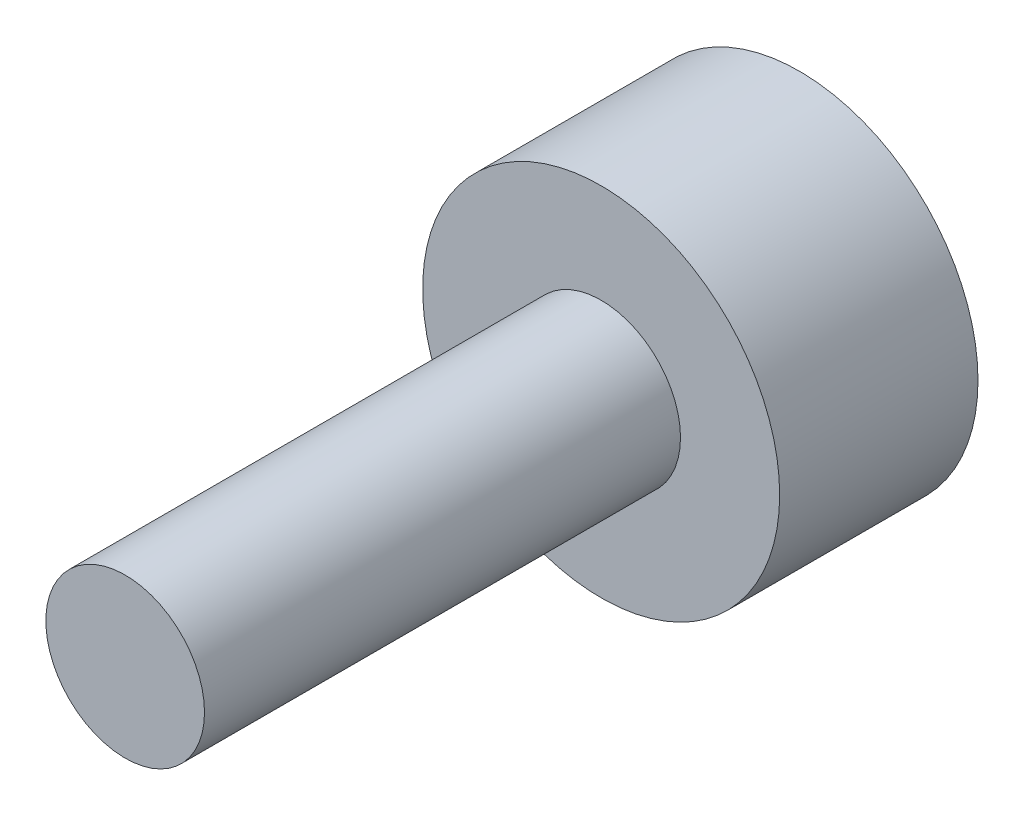
ISO-10303-21;
HEADER;
FILE_DESCRIPTION(('STEP AP214'),'2;1');
FILE_NAME('part.step','',(''),(''),'','','');
FILE_SCHEMA(('AUTOMOTIVE_DESIGN { 1 0 10303 214 1 1 1 1 }'));
ENDSEC;
DATA;
#1=APPLICATION_CONTEXT('core data for automotive mechanical design processes');
#2=APPLICATION_PROTOCOL_DEFINITION('international standard','automotive_design',2000,#1);
#3=PRODUCT_CONTEXT('',#1,'mechanical');
#4=PRODUCT('Part','Part','',(#3));
#5=PRODUCT_RELATED_PRODUCT_CATEGORY('part','',(#4));
#6=PRODUCT_DEFINITION_FORMATION('','',#4);
#7=PRODUCT_DEFINITION_CONTEXT('part definition',#1,'design');
#8=PRODUCT_DEFINITION('design','',#6,#7);
#9=PRODUCT_DEFINITION_SHAPE('','',#8);
#10=(LENGTH_UNIT() NAMED_UNIT(*) SI_UNIT(.MILLI.,.METRE.));
#11=(NAMED_UNIT(*) PLANE_ANGLE_UNIT() SI_UNIT($,.RADIAN.));
#12=(NAMED_UNIT(*) SI_UNIT($,.STERADIAN.) SOLID_ANGLE_UNIT());
#13=UNCERTAINTY_MEASURE_WITH_UNIT(LENGTH_MEASURE(1.E-05),#10,'distance_accuracy_value','');
#14=(GEOMETRIC_REPRESENTATION_CONTEXT(3) GLOBAL_UNCERTAINTY_ASSIGNED_CONTEXT((#13)) GLOBAL_UNIT_ASSIGNED_CONTEXT((#10,
#11,#12)) REPRESENTATION_CONTEXT('',''));
#15=CARTESIAN_POINT('',(0.,0.,0.));
#16=DIRECTION('',(0.,0.,1.));
#17=DIRECTION('',(1.,0.,0.));
#18=AXIS2_PLACEMENT_3D('',#15,#16,#17);
#19=CARTESIAN_POINT('',(0.,0.,2.5));
#20=DIRECTION('',(0.,0.,1.));
#21=DIRECTION('',(1.,0.,0.));
#22=AXIS2_PLACEMENT_3D('',#19,#20,#21);
#23=PLANE('',#22);
#24=CARTESIAN_POINT('',(0.,0.,2.5));
#25=DIRECTION('',(0.,0.,1.));
#26=DIRECTION('',(1.,0.,0.));
#27=AXIS2_PLACEMENT_3D('',#24,#25,#26);
#28=CIRCLE('',#27,2.25);
#29=CARTESIAN_POINT('',(2.25,0.,2.5));
#30=VERTEX_POINT('',#29);
#31=EDGE_CURVE('E11',#30,#30,#28,.T.);
#32=ORIENTED_EDGE('',*,*,#31,.T.);
#33=EDGE_LOOP('',(#32));
#34=FACE_BOUND('',#33,.T.);
#35=CARTESIAN_POINT('',(0.,0.,2.5));
#36=DIRECTION('',(0.,0.,1.));
#37=DIRECTION('',(1.,0.,0.));
#38=AXIS2_PLACEMENT_3D('',#35,#36,#37);
#39=CIRCLE('',#38,1.);
#40=CARTESIAN_POINT('',(1.,0.,2.5));
#41=VERTEX_POINT('',#40);
#42=EDGE_CURVE('E139',#41,#41,#39,.T.);
#43=ORIENTED_EDGE('',*,*,#42,.F.);
#44=EDGE_LOOP('',(#43));
#45=FACE_BOUND('',#44,.T.);
#46=ADVANCED_FACE('F37',(#34,#45),#23,.T.);
#47=CARTESIAN_POINT('',(0.,0.,2.5));
#48=DIRECTION('',(0.,0.,-1.));
#49=DIRECTION('',(-1.,0.,0.));
#50=AXIS2_PLACEMENT_3D('',#47,#48,#49);
#51=CYLINDRICAL_SURFACE('',#50,2.25);
#52=ORIENTED_EDGE('',*,*,#31,.F.);
#53=EDGE_LOOP('',(#52));
#54=FACE_BOUND('',#53,.T.);
#55=CARTESIAN_POINT('',(0.,0.,0.));
#56=DIRECTION('',(0.,0.,1.));
#57=DIRECTION('',(1.,0.,0.));
#58=AXIS2_PLACEMENT_3D('',#55,#56,#57);
#59=CIRCLE('',#58,2.25);
#60=CARTESIAN_POINT('',(2.25,0.,0.));
#61=VERTEX_POINT('',#60);
#62=EDGE_CURVE('E41',#61,#61,#59,.T.);
#63=ORIENTED_EDGE('',*,*,#62,.T.);
#64=EDGE_LOOP('',(#63));
#65=FACE_BOUND('',#64,.T.);
#66=ADVANCED_FACE('F39',(#54,#65),#51,.T.);
#67=CARTESIAN_POINT('',(0.,0.,0.));
#68=DIRECTION('',(0.,0.,1.));
#69=DIRECTION('',(1.,0.,0.));
#70=AXIS2_PLACEMENT_3D('',#67,#68,#69);
#71=PLANE('',#70);
#72=DIRECTION('',(-0.205557637970208,0.978645010957553,0.));
#73=VECTOR('',#72,1.);
#74=CARTESIAN_POINT('',(-0.852242502162426,-0.763657678817253,0.));
#75=LINE('',#74,#73);
#76=CARTESIAN_POINT('',(-0.852242502162426,-0.763657678817253,0.));
#77=VERTEX_POINT('',#76);
#78=CARTESIAN_POINT('',(-1.08746820073201,0.356234817648851,0.));
#79=VERTEX_POINT('',#78);
#80=EDGE_CURVE('E126',#77,#79,#75,.T.);
#81=ORIENTED_EDGE('',*,*,#80,.F.);
#82=DIRECTION('',(-0.950310259761245,0.311304369054652,0.));
#83=VECTOR('',#82,1.);
#84=CARTESIAN_POINT('',(0.235225698569587,-1.1198924964661,0.));
#85=LINE('',#84,#83);
#86=CARTESIAN_POINT('',(0.235225698569587,-1.1198924964661,0.));
#87=VERTEX_POINT('',#86);
#88=EDGE_CURVE('E52',#87,#77,#85,.T.);
#89=ORIENTED_EDGE('',*,*,#88,.F.);
#90=DIRECTION('',(-0.744752621791037,-0.667340641902901,0.));
#91=VECTOR('',#90,1.);
#92=CARTESIAN_POINT('',(1.08746820073201,-0.356234817648848,0.));
#93=LINE('',#92,#91);
#94=CARTESIAN_POINT('',(1.08746820073201,-0.356234817648848,0.));
#95=VERTEX_POINT('',#94);
#96=EDGE_CURVE('E135',#95,#87,#93,.T.);
#97=ORIENTED_EDGE('',*,*,#96,.F.);
#98=DIRECTION('',(0.205557637970207,-0.978645010957553,0.));
#99=VECTOR('',#98,1.);
#100=CARTESIAN_POINT('',(0.852242502162427,0.763657678817255,0.));
#101=LINE('',#100,#99);
#102=CARTESIAN_POINT('',(0.852242502162427,0.763657678817255,0.));
#103=VERTEX_POINT('',#102);
#104=EDGE_CURVE('E133',#103,#95,#101,.T.);
#105=ORIENTED_EDGE('',*,*,#104,.F.);
#106=DIRECTION('',(0.950310259761245,-0.311304369054652,0.));
#107=VECTOR('',#106,1.);
#108=CARTESIAN_POINT('',(-0.235225698569587,1.1198924964661,0.));
#109=LINE('',#108,#107);
#110=CARTESIAN_POINT('',(-0.235225698569587,1.1198924964661,0.));
#111=VERTEX_POINT('',#110);
#112=EDGE_CURVE('E100',#111,#103,#109,.T.);
#113=ORIENTED_EDGE('',*,*,#112,.F.);
#114=DIRECTION('',(0.744752621791037,0.667340641902901,0.));
#115=VECTOR('',#114,1.);
#116=CARTESIAN_POINT('',(-1.08746820073201,0.356234817648851,0.));
#117=LINE('',#116,#115);
#118=EDGE_CURVE('E129',#79,#111,#117,.T.);
#119=ORIENTED_EDGE('',*,*,#118,.F.);
#120=EDGE_LOOP('',(#81,#89,#97,#105,#113,#119));
#121=FACE_BOUND('',#120,.T.);
#122=ORIENTED_EDGE('',*,*,#62,.F.);
#123=EDGE_LOOP('',(#122));
#124=FACE_BOUND('',#123,.T.);
#125=ADVANCED_FACE('F159',(#121,#124),#71,.F.);
#126=CARTESIAN_POINT('',(0.,0.,8.5));
#127=DIRECTION('',(0.,0.,-1.));
#128=DIRECTION('',(-1.,0.,0.));
#129=AXIS2_PLACEMENT_3D('',#126,#127,#128);
#130=CYLINDRICAL_SURFACE('',#129,1.);
#131=CARTESIAN_POINT('',(0.,0.,8.5));
#132=DIRECTION('',(0.,0.,1.));
#133=DIRECTION('',(1.,0.,0.));
#134=AXIS2_PLACEMENT_3D('',#131,#132,#133);
#135=CIRCLE('',#134,1.);
#136=CARTESIAN_POINT('',(1.,0.,8.5));
#137=VERTEX_POINT('',#136);
#138=EDGE_CURVE('E145',#137,#137,#135,.T.);
#139=ORIENTED_EDGE('',*,*,#138,.F.);
#140=EDGE_LOOP('',(#139));
#141=FACE_BOUND('',#140,.T.);
#142=ORIENTED_EDGE('',*,*,#42,.T.);
#143=EDGE_LOOP('',(#142));
#144=FACE_BOUND('',#143,.T.);
#145=ADVANCED_FACE('F151',(#141,#144),#130,.T.);
#146=CARTESIAN_POINT('',(0.,0.,8.5));
#147=DIRECTION('',(0.,0.,1.));
#148=DIRECTION('',(1.,0.,0.));
#149=AXIS2_PLACEMENT_3D('',#146,#147,#148);
#150=PLANE('',#149);
#151=ORIENTED_EDGE('',*,*,#138,.T.);
#152=EDGE_LOOP('',(#151));
#153=FACE_BOUND('',#152,.T.);
#154=ADVANCED_FACE('F168',(#153),#150,.T.);
#155=CARTESIAN_POINT('',(0.235225698569587,-1.1198924964661,2.));
#156=DIRECTION('',(-0.311304369054652,-0.950310259761245,0.));
#157=DIRECTION('',(0.950310259761245,-0.311304369054652,0.));
#158=AXIS2_PLACEMENT_3D('',#155,#156,#157);
#159=PLANE('',#158);
#160=ORIENTED_EDGE('',*,*,#88,.T.);
#161=DIRECTION('',(0.,0.,-1.));
#162=VECTOR('',#161,1.);
#163=CARTESIAN_POINT('',(-0.852242502162426,-0.763657678817253,2.));
#164=LINE('',#163,#162);
#165=CARTESIAN_POINT('',(-0.852242502162426,-0.763657678817253,2.));
#166=VERTEX_POINT('',#165);
#167=EDGE_CURVE('E82',#166,#77,#164,.T.);
#168=ORIENTED_EDGE('',*,*,#167,.F.);
#169=DIRECTION('',(-0.950310259761245,0.311304369054652,0.));
#170=VECTOR('',#169,1.);
#171=CARTESIAN_POINT('',(0.235225698569587,-1.1198924964661,2.));
#172=LINE('',#171,#170);
#173=CARTESIAN_POINT('',(0.235225698569587,-1.1198924964661,2.));
#174=VERTEX_POINT('',#173);
#175=EDGE_CURVE('E137',#174,#166,#172,.T.);
#176=ORIENTED_EDGE('',*,*,#175,.F.);
#177=DIRECTION('',(0.,0.,-1.));
#178=VECTOR('',#177,1.);
#179=CARTESIAN_POINT('',(0.235225698569587,-1.1198924964661,2.));
#180=LINE('',#179,#178);
#181=EDGE_CURVE('E60',#174,#87,#180,.T.);
#182=ORIENTED_EDGE('',*,*,#181,.T.);
#183=EDGE_LOOP('',(#160,#168,#176,#182));
#184=FACE_BOUND('',#183,.T.);
#185=ADVANCED_FACE('F180',(#184),#159,.F.);
#186=CARTESIAN_POINT('',(1.08746820073201,-0.356234817648848,2.));
#187=DIRECTION('',(0.667340641902901,-0.744752621791037,0.));
#188=DIRECTION('',(0.744752621791037,0.667340641902901,0.));
#189=AXIS2_PLACEMENT_3D('',#186,#187,#188);
#190=PLANE('',#189);
#191=ORIENTED_EDGE('',*,*,#96,.T.);
#192=ORIENTED_EDGE('',*,*,#181,.F.);
#193=DIRECTION('',(-0.744752621791037,-0.667340641902901,0.));
#194=VECTOR('',#193,1.);
#195=CARTESIAN_POINT('',(1.08746820073201,-0.356234817648848,2.));
#196=LINE('',#195,#194);
#197=CARTESIAN_POINT('',(1.08746820073201,-0.356234817648848,2.));
#198=VERTEX_POINT('',#197);
#199=EDGE_CURVE('E112',#198,#174,#196,.T.);
#200=ORIENTED_EDGE('',*,*,#199,.F.);
#201=DIRECTION('',(0.,0.,-1.));
#202=VECTOR('',#201,1.);
#203=CARTESIAN_POINT('',(1.08746820073201,-0.356234817648848,2.));
#204=LINE('',#203,#202);
#205=EDGE_CURVE('E104',#198,#95,#204,.T.);
#206=ORIENTED_EDGE('',*,*,#205,.T.);
#207=EDGE_LOOP('',(#191,#192,#200,#206));
#208=FACE_BOUND('',#207,.T.);
#209=ADVANCED_FACE('F182',(#208),#190,.F.);
#210=CARTESIAN_POINT('',(0.852242502162427,0.763657678817255,2.));
#211=DIRECTION('',(0.978645010957553,0.205557637970207,0.));
#212=DIRECTION('',(-0.205557637970207,0.978645010957553,0.));
#213=AXIS2_PLACEMENT_3D('',#210,#211,#212);
#214=PLANE('',#213);
#215=ORIENTED_EDGE('',*,*,#104,.T.);
#216=ORIENTED_EDGE('',*,*,#205,.F.);
#217=DIRECTION('',(0.205557637970207,-0.978645010957553,0.));
#218=VECTOR('',#217,1.);
#219=CARTESIAN_POINT('',(0.852242502162427,0.763657678817255,2.));
#220=LINE('',#219,#218);
#221=CARTESIAN_POINT('',(0.852242502162427,0.763657678817255,2.));
#222=VERTEX_POINT('',#221);
#223=EDGE_CURVE('E108',#222,#198,#220,.T.);
#224=ORIENTED_EDGE('',*,*,#223,.F.);
#225=DIRECTION('',(0.,0.,-1.));
#226=VECTOR('',#225,1.);
#227=CARTESIAN_POINT('',(0.852242502162427,0.763657678817255,2.));
#228=LINE('',#227,#226);
#229=EDGE_CURVE('E93',#222,#103,#228,.T.);
#230=ORIENTED_EDGE('',*,*,#229,.T.);
#231=EDGE_LOOP('',(#215,#216,#224,#230));
#232=FACE_BOUND('',#231,.T.);
#233=ADVANCED_FACE('F109',(#232),#214,.F.);
#234=CARTESIAN_POINT('',(-0.235225698569587,1.1198924964661,2.));
#235=DIRECTION('',(0.311304369054652,0.950310259761245,0.));
#236=DIRECTION('',(-0.950310259761245,0.311304369054652,0.));
#237=AXIS2_PLACEMENT_3D('',#234,#235,#236);
#238=PLANE('',#237);
#239=ORIENTED_EDGE('',*,*,#112,.T.);
#240=ORIENTED_EDGE('',*,*,#229,.F.);
#241=DIRECTION('',(0.950310259761245,-0.311304369054652,0.));
#242=VECTOR('',#241,1.);
#243=CARTESIAN_POINT('',(-0.235225698569587,1.1198924964661,2.));
#244=LINE('',#243,#242);
#245=CARTESIAN_POINT('',(-0.235225698569587,1.1198924964661,2.));
#246=VERTEX_POINT('',#245);
#247=EDGE_CURVE('E97',#246,#222,#244,.T.);
#248=ORIENTED_EDGE('',*,*,#247,.F.);
#249=DIRECTION('',(0.,0.,-1.));
#250=VECTOR('',#249,1.);
#251=CARTESIAN_POINT('',(-0.235225698569587,1.1198924964661,2.));
#252=LINE('',#251,#250);
#253=EDGE_CURVE('E105',#246,#111,#252,.T.);
#254=ORIENTED_EDGE('',*,*,#253,.T.);
#255=EDGE_LOOP('',(#239,#240,#248,#254));
#256=FACE_BOUND('',#255,.T.);
#257=ADVANCED_FACE('F95',(#256),#238,.F.);
#258=CARTESIAN_POINT('',(-1.08746820073201,0.356234817648851,2.));
#259=DIRECTION('',(-0.667340641902901,0.744752621791037,0.));
#260=DIRECTION('',(-0.744752621791038,-0.667340641902901,0.));
#261=AXIS2_PLACEMENT_3D('',#258,#259,#260);
#262=PLANE('',#261);
#263=ORIENTED_EDGE('',*,*,#118,.T.);
#264=ORIENTED_EDGE('',*,*,#253,.F.);
#265=DIRECTION('',(0.744752621791037,0.667340641902901,0.));
#266=VECTOR('',#265,1.);
#267=CARTESIAN_POINT('',(-1.08746820073201,0.356234817648851,2.));
#268=LINE('',#267,#266);
#269=CARTESIAN_POINT('',(-1.08746820073201,0.356234817648851,2.));
#270=VERTEX_POINT('',#269);
#271=EDGE_CURVE('E118',#270,#246,#268,.T.);
#272=ORIENTED_EDGE('',*,*,#271,.F.);
#273=DIRECTION('',(0.,0.,-1.));
#274=VECTOR('',#273,1.);
#275=CARTESIAN_POINT('',(-1.08746820073201,0.356234817648851,2.));
#276=LINE('',#275,#274);
#277=EDGE_CURVE('E142',#270,#79,#276,.T.);
#278=ORIENTED_EDGE('',*,*,#277,.T.);
#279=EDGE_LOOP('',(#263,#264,#272,#278));
#280=FACE_BOUND('',#279,.T.);
#281=ADVANCED_FACE('F193',(#280),#262,.F.);
#282=CARTESIAN_POINT('',(-0.852242502162426,-0.763657678817253,2.));
#283=DIRECTION('',(-0.978645010957553,-0.205557637970208,0.));
#284=DIRECTION('',(0.205557637970208,-0.978645010957553,0.));
#285=AXIS2_PLACEMENT_3D('',#282,#283,#284);
#286=PLANE('',#285);
#287=ORIENTED_EDGE('',*,*,#80,.T.);
#288=ORIENTED_EDGE('',*,*,#277,.F.);
#289=DIRECTION('',(-0.205557637970208,0.978645010957553,0.));
#290=VECTOR('',#289,1.);
#291=CARTESIAN_POINT('',(-0.852242502162426,-0.763657678817253,2.));
#292=LINE('',#291,#290);
#293=EDGE_CURVE('E120',#166,#270,#292,.T.);
#294=ORIENTED_EDGE('',*,*,#293,.F.);
#295=ORIENTED_EDGE('',*,*,#167,.T.);
#296=EDGE_LOOP('',(#287,#288,#294,#295));
#297=FACE_BOUND('',#296,.T.);
#298=ADVANCED_FACE('F178',(#297),#286,.F.);
#299=CARTESIAN_POINT('',(0.,0.,2.));
#300=DIRECTION('',(0.,0.,-1.));
#301=DIRECTION('',(-1.,0.,0.));
#302=AXIS2_PLACEMENT_3D('',#299,#300,#301);
#303=PLANE('',#302);
#304=ORIENTED_EDGE('',*,*,#175,.T.);
#305=ORIENTED_EDGE('',*,*,#293,.T.);
#306=ORIENTED_EDGE('',*,*,#271,.T.);
#307=ORIENTED_EDGE('',*,*,#247,.T.);
#308=ORIENTED_EDGE('',*,*,#223,.T.);
#309=ORIENTED_EDGE('',*,*,#199,.T.);
#310=EDGE_LOOP('',(#304,#305,#306,#307,#308,#309));
#311=FACE_BOUND('',#310,.T.);
#312=ADVANCED_FACE('F115',(#311),#303,.T.);
#313=CLOSED_SHELL('',(#46,#66,#125,#145,#154,#185,#209,#233,#257,#281,#298,#312));
#314=MANIFOLD_SOLID_BREP('B2',#313);
#315=ADVANCED_BREP_SHAPE_REPRESENTATION('',(#18,#314),#14);
#316=SHAPE_DEFINITION_REPRESENTATION(#9,#315);
ENDSEC;
END-ISO-10303-21;
